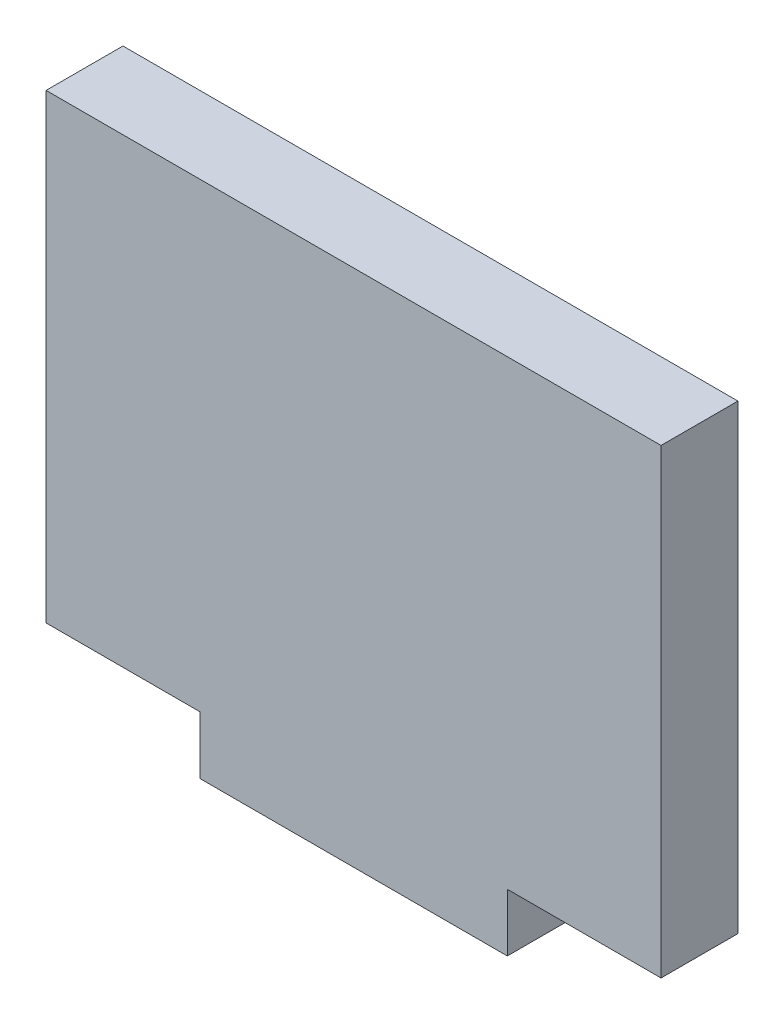
ISO-10303-21;
HEADER;
FILE_DESCRIPTION(('STEP AP214'),'2;1');
FILE_NAME('part.step','',(''),(''),'','','');
FILE_SCHEMA(('AUTOMOTIVE_DESIGN { 1 0 10303 214 1 1 1 1 }'));
ENDSEC;
DATA;
#1=APPLICATION_CONTEXT('core data for automotive mechanical design processes');
#2=APPLICATION_PROTOCOL_DEFINITION('international standard','automotive_design',2000,#1);
#3=PRODUCT_CONTEXT('',#1,'mechanical');
#4=PRODUCT('Part','Part','',(#3));
#5=PRODUCT_RELATED_PRODUCT_CATEGORY('part','',(#4));
#6=PRODUCT_DEFINITION_FORMATION('','',#4);
#7=PRODUCT_DEFINITION_CONTEXT('part definition',#1,'design');
#8=PRODUCT_DEFINITION('design','',#6,#7);
#9=PRODUCT_DEFINITION_SHAPE('','',#8);
#10=(LENGTH_UNIT() NAMED_UNIT(*) SI_UNIT(.MILLI.,.METRE.));
#11=(NAMED_UNIT(*) PLANE_ANGLE_UNIT() SI_UNIT($,.RADIAN.));
#12=(NAMED_UNIT(*) SI_UNIT($,.STERADIAN.) SOLID_ANGLE_UNIT());
#13=UNCERTAINTY_MEASURE_WITH_UNIT(LENGTH_MEASURE(1.E-05),#10,'distance_accuracy_value','');
#14=(GEOMETRIC_REPRESENTATION_CONTEXT(3) GLOBAL_UNCERTAINTY_ASSIGNED_CONTEXT((#13)) GLOBAL_UNIT_ASSIGNED_CONTEXT((#10,
#11,#12)) REPRESENTATION_CONTEXT('',''));
#15=CARTESIAN_POINT('',(0.,0.,0.));
#16=DIRECTION('',(0.,0.,1.));
#17=DIRECTION('',(1.,0.,0.));
#18=AXIS2_PLACEMENT_3D('',#15,#16,#17);
#19=CARTESIAN_POINT('',(0.,0.,3.175));
#20=DIRECTION('',(1.,0.,0.));
#21=DIRECTION('',(0.,0.,-1.));
#22=AXIS2_PLACEMENT_3D('',#19,#20,#21);
#23=PLANE('',#22);
#24=DIRECTION('',(0.,-1.,0.));
#25=VECTOR('',#24,1.);
#26=CARTESIAN_POINT('',(0.,0.,0.));
#27=LINE('',#26,#25);
#28=CARTESIAN_POINT('',(0.,19.05,0.));
#29=VERTEX_POINT('',#28);
#30=CARTESIAN_POINT('',(0.,0.,0.));
#31=VERTEX_POINT('',#30);
#32=EDGE_CURVE('E128',#29,#31,#27,.T.);
#33=ORIENTED_EDGE('',*,*,#32,.T.);
#34=DIRECTION('',(0.,0.,-1.));
#35=VECTOR('',#34,1.);
#36=CARTESIAN_POINT('',(0.,0.,3.175));
#37=LINE('',#36,#35);
#38=CARTESIAN_POINT('',(0.,0.,3.175));
#39=VERTEX_POINT('',#38);
#40=EDGE_CURVE('E11',#39,#31,#37,.T.);
#41=ORIENTED_EDGE('',*,*,#40,.F.);
#42=DIRECTION('',(0.,-1.,0.));
#43=VECTOR('',#42,1.);
#44=CARTESIAN_POINT('',(0.,0.,3.175));
#45=LINE('',#44,#43);
#46=CARTESIAN_POINT('',(0.,19.05,3.175));
#47=VERTEX_POINT('',#46);
#48=EDGE_CURVE('E142',#47,#39,#45,.T.);
#49=ORIENTED_EDGE('',*,*,#48,.F.);
#50=DIRECTION('',(0.,0.,-1.));
#51=VECTOR('',#50,1.);
#52=CARTESIAN_POINT('',(0.,19.05,3.175));
#53=LINE('',#52,#51);
#54=EDGE_CURVE('E124',#47,#29,#53,.T.);
#55=ORIENTED_EDGE('',*,*,#54,.T.);
#56=EDGE_LOOP('',(#33,#41,#49,#55));
#57=FACE_BOUND('',#56,.T.);
#58=ADVANCED_FACE('F32',(#57),#23,.F.);
#59=CARTESIAN_POINT('',(0.,0.,3.175));
#60=DIRECTION('',(0.,1.,0.));
#61=DIRECTION('',(0.,0.,1.));
#62=AXIS2_PLACEMENT_3D('',#59,#60,#61);
#63=PLANE('',#62);
#64=DIRECTION('',(1.,0.,0.));
#65=VECTOR('',#64,1.);
#66=CARTESIAN_POINT('',(0.,0.,0.));
#67=LINE('',#66,#65);
#68=CARTESIAN_POINT('',(6.35,0.,0.));
#69=VERTEX_POINT('',#68);
#70=EDGE_CURVE('E131',#31,#69,#67,.T.);
#71=ORIENTED_EDGE('',*,*,#70,.T.);
#72=DIRECTION('',(0.,0.,-1.));
#73=VECTOR('',#72,1.);
#74=CARTESIAN_POINT('',(6.35,0.,3.175));
#75=LINE('',#74,#73);
#76=CARTESIAN_POINT('',(6.35,0.,3.175));
#77=VERTEX_POINT('',#76);
#78=EDGE_CURVE('E40',#77,#69,#75,.T.);
#79=ORIENTED_EDGE('',*,*,#78,.F.);
#80=DIRECTION('',(1.,0.,0.));
#81=VECTOR('',#80,1.);
#82=CARTESIAN_POINT('',(0.,0.,3.175));
#83=LINE('',#82,#81);
#84=EDGE_CURVE('E91',#39,#77,#83,.T.);
#85=ORIENTED_EDGE('',*,*,#84,.F.);
#86=ORIENTED_EDGE('',*,*,#40,.T.);
#87=EDGE_LOOP('',(#71,#79,#85,#86));
#88=FACE_BOUND('',#87,.T.);
#89=ADVANCED_FACE('F177',(#88),#63,.F.);
#90=CARTESIAN_POINT('',(6.35,0.,3.175));
#91=DIRECTION('',(1.,0.,0.));
#92=DIRECTION('',(0.,0.,-1.));
#93=AXIS2_PLACEMENT_3D('',#90,#91,#92);
#94=PLANE('',#93);
#95=DIRECTION('',(0.,-1.,0.));
#96=VECTOR('',#95,1.);
#97=CARTESIAN_POINT('',(6.35,0.,0.));
#98=LINE('',#97,#96);
#99=CARTESIAN_POINT('',(6.35,-2.38793491823931,0.));
#100=VERTEX_POINT('',#99);
#101=EDGE_CURVE('E133',#69,#100,#98,.T.);
#102=ORIENTED_EDGE('',*,*,#101,.T.);
#103=DIRECTION('',(0.,0.,-1.));
#104=VECTOR('',#103,1.);
#105=CARTESIAN_POINT('',(6.35,-2.38793491823931,3.175));
#106=LINE('',#105,#104);
#107=CARTESIAN_POINT('',(6.35,-2.38793491823931,3.175));
#108=VERTEX_POINT('',#107);
#109=EDGE_CURVE('E149',#108,#100,#106,.T.);
#110=ORIENTED_EDGE('',*,*,#109,.F.);
#111=DIRECTION('',(0.,-1.,0.));
#112=VECTOR('',#111,1.);
#113=CARTESIAN_POINT('',(6.35,0.,3.175));
#114=LINE('',#113,#112);
#115=EDGE_CURVE('E157',#77,#108,#114,.T.);
#116=ORIENTED_EDGE('',*,*,#115,.F.);
#117=ORIENTED_EDGE('',*,*,#78,.T.);
#118=EDGE_LOOP('',(#102,#110,#116,#117));
#119=FACE_BOUND('',#118,.T.);
#120=ADVANCED_FACE('F155',(#119),#94,.F.);
#121=CARTESIAN_POINT('',(6.35,-2.38793491823931,3.175));
#122=DIRECTION('',(0.,1.,0.));
#123=DIRECTION('',(0.,0.,1.));
#124=AXIS2_PLACEMENT_3D('',#121,#122,#123);
#125=PLANE('',#124);
#126=DIRECTION('',(1.,0.,0.));
#127=VECTOR('',#126,1.);
#128=CARTESIAN_POINT('',(6.35,-2.38793491823931,0.));
#129=LINE('',#128,#127);
#130=CARTESIAN_POINT('',(19.05,-2.38793491823931,0.));
#131=VERTEX_POINT('',#130);
#132=EDGE_CURVE('E135',#100,#131,#129,.T.);
#133=ORIENTED_EDGE('',*,*,#132,.T.);
#134=DIRECTION('',(0.,0.,-1.));
#135=VECTOR('',#134,1.);
#136=CARTESIAN_POINT('',(19.05,-2.38793491823931,3.175));
#137=LINE('',#136,#135);
#138=CARTESIAN_POINT('',(19.05,-2.38793491823931,3.175));
#139=VERTEX_POINT('',#138);
#140=EDGE_CURVE('E146',#139,#131,#137,.T.);
#141=ORIENTED_EDGE('',*,*,#140,.F.);
#142=DIRECTION('',(1.,0.,0.));
#143=VECTOR('',#142,1.);
#144=CARTESIAN_POINT('',(6.35,-2.38793491823931,3.175));
#145=LINE('',#144,#143);
#146=EDGE_CURVE('E169',#108,#139,#145,.T.);
#147=ORIENTED_EDGE('',*,*,#146,.F.);
#148=ORIENTED_EDGE('',*,*,#109,.T.);
#149=EDGE_LOOP('',(#133,#141,#147,#148));
#150=FACE_BOUND('',#149,.T.);
#151=ADVANCED_FACE('F165',(#150),#125,.F.);
#152=CARTESIAN_POINT('',(19.05,-2.38793491823931,3.175));
#153=DIRECTION('',(-1.,0.,0.));
#154=DIRECTION('',(0.,0.,1.));
#155=AXIS2_PLACEMENT_3D('',#152,#153,#154);
#156=PLANE('',#155);
#157=DIRECTION('',(0.,1.,0.));
#158=VECTOR('',#157,1.);
#159=CARTESIAN_POINT('',(19.05,-2.38793491823931,0.));
#160=LINE('',#159,#158);
#161=CARTESIAN_POINT('',(19.05,0.,0.));
#162=VERTEX_POINT('',#161);
#163=EDGE_CURVE('E137',#131,#162,#160,.T.);
#164=ORIENTED_EDGE('',*,*,#163,.T.);
#165=DIRECTION('',(0.,0.,-1.));
#166=VECTOR('',#165,1.);
#167=CARTESIAN_POINT('',(19.05,0.,3.175));
#168=LINE('',#167,#166);
#169=CARTESIAN_POINT('',(19.05,0.,3.175));
#170=VERTEX_POINT('',#169);
#171=EDGE_CURVE('E119',#170,#162,#168,.T.);
#172=ORIENTED_EDGE('',*,*,#171,.F.);
#173=DIRECTION('',(0.,1.,0.));
#174=VECTOR('',#173,1.);
#175=CARTESIAN_POINT('',(19.05,-2.38793491823931,3.175));
#176=LINE('',#175,#174);
#177=EDGE_CURVE('E110',#139,#170,#176,.T.);
#178=ORIENTED_EDGE('',*,*,#177,.F.);
#179=ORIENTED_EDGE('',*,*,#140,.T.);
#180=EDGE_LOOP('',(#164,#172,#178,#179));
#181=FACE_BOUND('',#180,.T.);
#182=ADVANCED_FACE('F168',(#181),#156,.F.);
#183=CARTESIAN_POINT('',(19.05,0.,3.175));
#184=DIRECTION('',(0.,1.,0.));
#185=DIRECTION('',(0.,0.,1.));
#186=AXIS2_PLACEMENT_3D('',#183,#184,#185);
#187=PLANE('',#186);
#188=DIRECTION('',(1.,0.,0.));
#189=VECTOR('',#188,1.);
#190=CARTESIAN_POINT('',(19.05,0.,0.));
#191=LINE('',#190,#189);
#192=CARTESIAN_POINT('',(25.4,0.,0.));
#193=VERTEX_POINT('',#192);
#194=EDGE_CURVE('E118',#162,#193,#191,.T.);
#195=ORIENTED_EDGE('',*,*,#194,.T.);
#196=DIRECTION('',(0.,0.,-1.));
#197=VECTOR('',#196,1.);
#198=CARTESIAN_POINT('',(25.4,0.,3.175));
#199=LINE('',#198,#197);
#200=CARTESIAN_POINT('',(25.4,0.,3.175));
#201=VERTEX_POINT('',#200);
#202=EDGE_CURVE('E115',#201,#193,#199,.T.);
#203=ORIENTED_EDGE('',*,*,#202,.F.);
#204=DIRECTION('',(1.,0.,0.));
#205=VECTOR('',#204,1.);
#206=CARTESIAN_POINT('',(19.05,0.,3.175));
#207=LINE('',#206,#205);
#208=EDGE_CURVE('E104',#170,#201,#207,.T.);
#209=ORIENTED_EDGE('',*,*,#208,.F.);
#210=ORIENTED_EDGE('',*,*,#171,.T.);
#211=EDGE_LOOP('',(#195,#203,#209,#210));
#212=FACE_BOUND('',#211,.T.);
#213=ADVANCED_FACE('F116',(#212),#187,.F.);
#214=CARTESIAN_POINT('',(25.4,0.,3.175));
#215=DIRECTION('',(-1.,0.,0.));
#216=DIRECTION('',(0.,0.,1.));
#217=AXIS2_PLACEMENT_3D('',#214,#215,#216);
#218=PLANE('',#217);
#219=DIRECTION('',(0.,1.,0.));
#220=VECTOR('',#219,1.);
#221=CARTESIAN_POINT('',(25.4,0.,0.));
#222=LINE('',#221,#220);
#223=CARTESIAN_POINT('',(25.4,19.05,0.));
#224=VERTEX_POINT('',#223);
#225=EDGE_CURVE('E77',#193,#224,#222,.T.);
#226=ORIENTED_EDGE('',*,*,#225,.T.);
#227=DIRECTION('',(0.,0.,-1.));
#228=VECTOR('',#227,1.);
#229=CARTESIAN_POINT('',(25.4,19.05,3.175));
#230=LINE('',#229,#228);
#231=CARTESIAN_POINT('',(25.4,19.05,3.175));
#232=VERTEX_POINT('',#231);
#233=EDGE_CURVE('E120',#232,#224,#230,.T.);
#234=ORIENTED_EDGE('',*,*,#233,.F.);
#235=DIRECTION('',(0.,1.,0.));
#236=VECTOR('',#235,1.);
#237=CARTESIAN_POINT('',(25.4,0.,3.175));
#238=LINE('',#237,#236);
#239=EDGE_CURVE('E108',#201,#232,#238,.T.);
#240=ORIENTED_EDGE('',*,*,#239,.F.);
#241=ORIENTED_EDGE('',*,*,#202,.T.);
#242=EDGE_LOOP('',(#226,#234,#240,#241));
#243=FACE_BOUND('',#242,.T.);
#244=ADVANCED_FACE('F122',(#243),#218,.F.);
#245=CARTESIAN_POINT('',(0.,19.05,3.175));
#246=DIRECTION('',(0.,-1.,0.));
#247=DIRECTION('',(0.,0.,-1.));
#248=AXIS2_PLACEMENT_3D('',#245,#246,#247);
#249=PLANE('',#248);
#250=DIRECTION('',(-1.,0.,0.));
#251=VECTOR('',#250,1.);
#252=CARTESIAN_POINT('',(0.,19.05,0.));
#253=LINE('',#252,#251);
#254=EDGE_CURVE('E83',#224,#29,#253,.T.);
#255=ORIENTED_EDGE('',*,*,#254,.T.);
#256=ORIENTED_EDGE('',*,*,#54,.F.);
#257=DIRECTION('',(-1.,0.,0.));
#258=VECTOR('',#257,1.);
#259=CARTESIAN_POINT('',(0.,19.05,3.175));
#260=LINE('',#259,#258);
#261=EDGE_CURVE('E48',#232,#47,#260,.T.);
#262=ORIENTED_EDGE('',*,*,#261,.F.);
#263=ORIENTED_EDGE('',*,*,#233,.T.);
#264=EDGE_LOOP('',(#255,#256,#262,#263));
#265=FACE_BOUND('',#264,.T.);
#266=ADVANCED_FACE('F193',(#265),#249,.F.);
#267=CARTESIAN_POINT('',(0.,0.,3.175));
#268=DIRECTION('',(0.,0.,-1.));
#269=DIRECTION('',(-1.,0.,0.));
#270=AXIS2_PLACEMENT_3D('',#267,#268,#269);
#271=PLANE('',#270);
#272=ORIENTED_EDGE('',*,*,#48,.T.);
#273=ORIENTED_EDGE('',*,*,#84,.T.);
#274=ORIENTED_EDGE('',*,*,#115,.T.);
#275=ORIENTED_EDGE('',*,*,#146,.T.);
#276=ORIENTED_EDGE('',*,*,#177,.T.);
#277=ORIENTED_EDGE('',*,*,#208,.T.);
#278=ORIENTED_EDGE('',*,*,#239,.T.);
#279=ORIENTED_EDGE('',*,*,#261,.T.);
#280=EDGE_LOOP('',(#272,#273,#274,#275,#276,#277,#278,#279));
#281=FACE_BOUND('',#280,.T.);
#282=ADVANCED_FACE('F106',(#281),#271,.F.);
#283=CARTESIAN_POINT('',(0.,0.,0.));
#284=DIRECTION('',(0.,0.,-1.));
#285=DIRECTION('',(-1.,0.,0.));
#286=AXIS2_PLACEMENT_3D('',#283,#284,#285);
#287=PLANE('',#286);
#288=ORIENTED_EDGE('',*,*,#32,.F.);
#289=ORIENTED_EDGE('',*,*,#254,.F.);
#290=ORIENTED_EDGE('',*,*,#225,.F.);
#291=ORIENTED_EDGE('',*,*,#194,.F.);
#292=ORIENTED_EDGE('',*,*,#163,.F.);
#293=ORIENTED_EDGE('',*,*,#132,.F.);
#294=ORIENTED_EDGE('',*,*,#101,.F.);
#295=ORIENTED_EDGE('',*,*,#70,.F.);
#296=EDGE_LOOP('',(#288,#289,#290,#291,#292,#293,#294,#295));
#297=FACE_BOUND('',#296,.T.);
#298=ADVANCED_FACE('F161',(#297),#287,.T.);
#299=CLOSED_SHELL('',(#58,#89,#120,#151,#182,#213,#244,#266,#282,#298));
#300=MANIFOLD_SOLID_BREP('B2',#299);
#301=ADVANCED_BREP_SHAPE_REPRESENTATION('',(#18,#300),#14);
#302=SHAPE_DEFINITION_REPRESENTATION(#9,#301);
ENDSEC;
END-ISO-10303-21;
